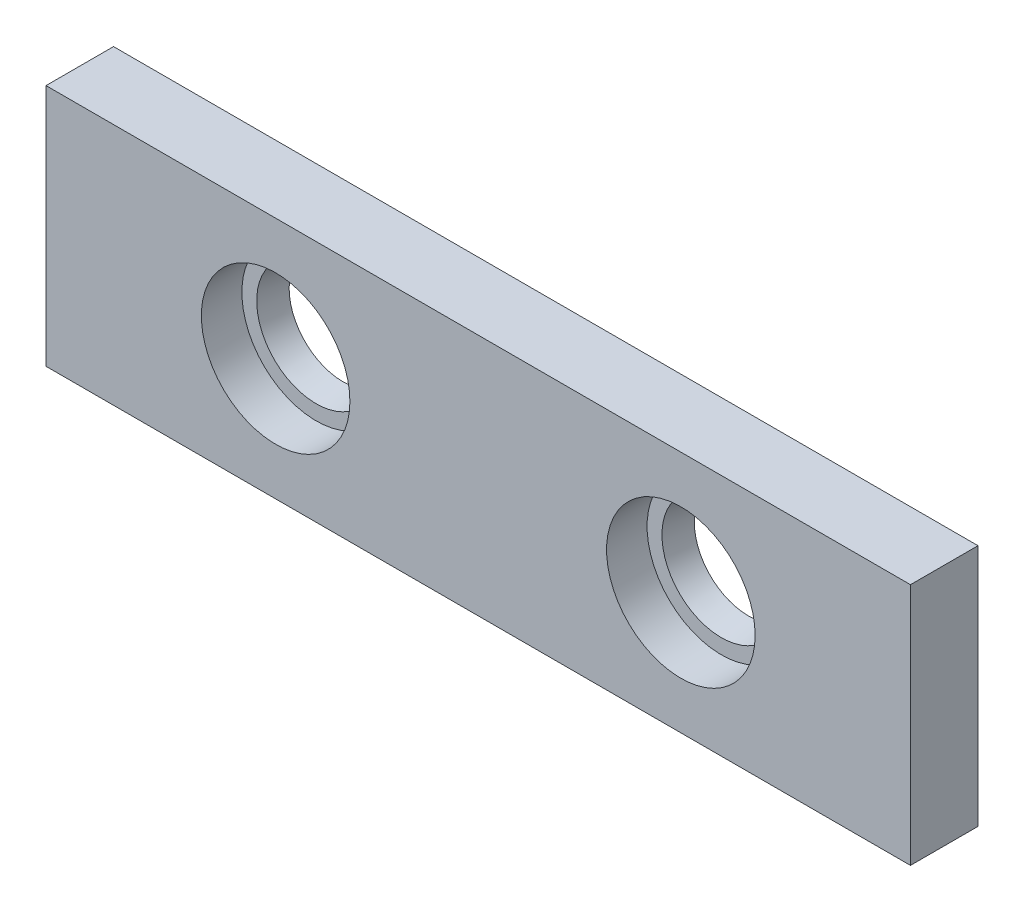
ISO-10303-21;
HEADER;
FILE_DESCRIPTION(('STEP AP214'),'2;1');
FILE_NAME('part.step','',(''),(''),'','','');
FILE_SCHEMA(('AUTOMOTIVE_DESIGN { 1 0 10303 214 1 1 1 1 }'));
ENDSEC;
DATA;
#1=APPLICATION_CONTEXT('core data for automotive mechanical design processes');
#2=APPLICATION_PROTOCOL_DEFINITION('international standard','automotive_design',2000,#1);
#3=PRODUCT_CONTEXT('',#1,'mechanical');
#4=PRODUCT('Part','Part','',(#3));
#5=PRODUCT_RELATED_PRODUCT_CATEGORY('part','',(#4));
#6=PRODUCT_DEFINITION_FORMATION('','',#4);
#7=PRODUCT_DEFINITION_CONTEXT('part definition',#1,'design');
#8=PRODUCT_DEFINITION('design','',#6,#7);
#9=PRODUCT_DEFINITION_SHAPE('','',#8);
#10=(LENGTH_UNIT() NAMED_UNIT(*) SI_UNIT(.MILLI.,.METRE.));
#11=(NAMED_UNIT(*) PLANE_ANGLE_UNIT() SI_UNIT($,.RADIAN.));
#12=(NAMED_UNIT(*) SI_UNIT($,.STERADIAN.) SOLID_ANGLE_UNIT());
#13=UNCERTAINTY_MEASURE_WITH_UNIT(LENGTH_MEASURE(1.E-05),#10,'distance_accuracy_value','');
#14=(GEOMETRIC_REPRESENTATION_CONTEXT(3) GLOBAL_UNCERTAINTY_ASSIGNED_CONTEXT((#13)) GLOBAL_UNIT_ASSIGNED_CONTEXT((#10,
#11,#12)) REPRESENTATION_CONTEXT('',''));
#15=CARTESIAN_POINT('',(0.,0.,0.));
#16=DIRECTION('',(0.,0.,1.));
#17=DIRECTION('',(1.,0.,0.));
#18=AXIS2_PLACEMENT_3D('',#15,#16,#17);
#19=CARTESIAN_POINT('',(0.,0.,5.));
#20=DIRECTION('',(0.,0.,-1.));
#21=DIRECTION('',(-1.,0.,0.));
#22=AXIS2_PLACEMENT_3D('',#19,#20,#21);
#23=PLANE('',#22);
#24=CARTESIAN_POINT('',(18.9208612165737,0.862610936427442,5.));
#25=DIRECTION('',(0.,0.,1.));
#26=DIRECTION('',(1.,0.,0.));
#27=AXIS2_PLACEMENT_3D('',#24,#25,#26);
#28=CIRCLE('',#27,5.5);
#29=CARTESIAN_POINT('',(24.4208612165736,0.862610936427442,5.));
#30=VERTEX_POINT('',#29);
#31=EDGE_CURVE('E179',#30,#30,#28,.T.);
#32=ORIENTED_EDGE('',*,*,#31,.F.);
#33=EDGE_LOOP('',(#32));
#34=FACE_BOUND('',#33,.T.);
#35=CARTESIAN_POINT('',(-11.0791387834266,0.862610936427438,5.));
#36=DIRECTION('',(0.,0.,1.));
#37=DIRECTION('',(1.,0.,0.));
#38=AXIS2_PLACEMENT_3D('',#35,#36,#37);
#39=CIRCLE('',#38,5.5);
#40=CARTESIAN_POINT('',(-5.57913878342655,0.862610936427438,5.));
#41=VERTEX_POINT('',#40);
#42=EDGE_CURVE('E165',#41,#41,#39,.T.);
#43=ORIENTED_EDGE('',*,*,#42,.F.);
#44=EDGE_LOOP('',(#43));
#45=FACE_BOUND('',#44,.T.);
#46=DIRECTION('',(1.,0.,0.));
#47=VECTOR('',#46,1.);
#48=CARTESIAN_POINT('',(-28.0791387834265,-8.13738906357256,5.));
#49=LINE('',#48,#47);
#50=CARTESIAN_POINT('',(-28.0791387834265,-8.13738906357256,5.));
#51=VERTEX_POINT('',#50);
#52=CARTESIAN_POINT('',(35.9208612165735,-8.13738906357256,5.));
#53=VERTEX_POINT('',#52);
#54=EDGE_CURVE('E113',#51,#53,#49,.T.);
#55=ORIENTED_EDGE('',*,*,#54,.T.);
#56=DIRECTION('',(0.,-1.,0.));
#57=VECTOR('',#56,1.);
#58=CARTESIAN_POINT('',(35.9208612165735,9.86261093642744,5.));
#59=LINE('',#58,#57);
#60=CARTESIAN_POINT('',(35.9208612165735,9.86261093642744,5.));
#61=VERTEX_POINT('',#60);
#62=EDGE_CURVE('E120',#61,#53,#59,.T.);
#63=ORIENTED_EDGE('',*,*,#62,.F.);
#64=DIRECTION('',(1.,0.,0.));
#65=VECTOR('',#64,1.);
#66=CARTESIAN_POINT('',(-28.0791387834265,9.86261093642744,5.));
#67=LINE('',#66,#65);
#68=CARTESIAN_POINT('',(-28.0791387834265,9.86261093642744,5.));
#69=VERTEX_POINT('',#68);
#70=EDGE_CURVE('E129',#69,#61,#67,.T.);
#71=ORIENTED_EDGE('',*,*,#70,.F.);
#72=DIRECTION('',(0.,-1.,0.));
#73=VECTOR('',#72,1.);
#74=CARTESIAN_POINT('',(-28.0791387834265,9.86261093642744,5.));
#75=LINE('',#74,#73);
#76=EDGE_CURVE('E90',#69,#51,#75,.T.);
#77=ORIENTED_EDGE('',*,*,#76,.T.);
#78=EDGE_LOOP('',(#55,#63,#71,#77));
#79=FACE_BOUND('',#78,.T.);
#80=ADVANCED_FACE('F70',(#34,#45,#79),#23,.F.);
#81=CARTESIAN_POINT('',(0.,0.,0.));
#82=DIRECTION('',(0.,0.,-1.));
#83=DIRECTION('',(-1.,0.,0.));
#84=AXIS2_PLACEMENT_3D('',#81,#82,#83);
#85=PLANE('',#84);
#86=CARTESIAN_POINT('',(18.9209996063444,0.862610936427444,0.));
#87=DIRECTION('',(0.,0.,-1.));
#88=DIRECTION('',(-1.,0.,0.));
#89=AXIS2_PLACEMENT_3D('',#86,#87,#88);
#90=CIRCLE('',#89,4.);
#91=CARTESIAN_POINT('',(14.9209996063444,0.862610936427444,0.));
#92=VERTEX_POINT('',#91);
#93=EDGE_CURVE('E173',#92,#92,#90,.T.);
#94=ORIENTED_EDGE('',*,*,#93,.F.);
#95=EDGE_LOOP('',(#94));
#96=FACE_BOUND('',#95,.T.);
#97=CARTESIAN_POINT('',(-11.0791387834265,0.862610936427444,0.));
#98=DIRECTION('',(0.,0.,-1.));
#99=DIRECTION('',(-1.,0.,0.));
#100=AXIS2_PLACEMENT_3D('',#97,#98,#99);
#101=CIRCLE('',#100,4.);
#102=CARTESIAN_POINT('',(-15.0791387834265,0.862610936427444,0.));
#103=VERTEX_POINT('',#102);
#104=EDGE_CURVE('E159',#103,#103,#101,.T.);
#105=ORIENTED_EDGE('',*,*,#104,.F.);
#106=EDGE_LOOP('',(#105));
#107=FACE_BOUND('',#106,.T.);
#108=DIRECTION('',(1.,0.,0.));
#109=VECTOR('',#108,1.);
#110=CARTESIAN_POINT('',(-28.0791387834265,-8.13738906357256,0.));
#111=LINE('',#110,#109);
#112=CARTESIAN_POINT('',(-28.0791387834265,-8.13738906357256,0.));
#113=VERTEX_POINT('',#112);
#114=CARTESIAN_POINT('',(35.9208612165735,-8.13738906357256,0.));
#115=VERTEX_POINT('',#114);
#116=EDGE_CURVE('E140',#113,#115,#111,.T.);
#117=ORIENTED_EDGE('',*,*,#116,.F.);
#118=DIRECTION('',(0.,-1.,0.));
#119=VECTOR('',#118,1.);
#120=CARTESIAN_POINT('',(-28.0791387834265,9.86261093642744,0.));
#121=LINE('',#120,#119);
#122=CARTESIAN_POINT('',(-28.0791387834265,9.86261093642744,0.));
#123=VERTEX_POINT('',#122);
#124=EDGE_CURVE('E108',#123,#113,#121,.T.);
#125=ORIENTED_EDGE('',*,*,#124,.F.);
#126=DIRECTION('',(1.,0.,0.));
#127=VECTOR('',#126,1.);
#128=CARTESIAN_POINT('',(-28.0791387834265,9.86261093642744,0.));
#129=LINE('',#128,#127);
#130=CARTESIAN_POINT('',(35.9208612165735,9.86261093642744,0.));
#131=VERTEX_POINT('',#130);
#132=EDGE_CURVE('E147',#123,#131,#129,.T.);
#133=ORIENTED_EDGE('',*,*,#132,.T.);
#134=DIRECTION('',(0.,-1.,0.));
#135=VECTOR('',#134,1.);
#136=CARTESIAN_POINT('',(35.9208612165735,9.86261093642744,0.));
#137=LINE('',#136,#135);
#138=EDGE_CURVE('E122',#131,#115,#137,.T.);
#139=ORIENTED_EDGE('',*,*,#138,.T.);
#140=EDGE_LOOP('',(#117,#125,#133,#139));
#141=FACE_BOUND('',#140,.T.);
#142=ADVANCED_FACE('F191',(#96,#107,#141),#85,.T.);
#143=CARTESIAN_POINT('',(-28.0791387834265,-8.13738906357256,5.));
#144=DIRECTION('',(0.,1.,0.));
#145=DIRECTION('',(0.,0.,1.));
#146=AXIS2_PLACEMENT_3D('',#143,#144,#145);
#147=PLANE('',#146);
#148=ORIENTED_EDGE('',*,*,#116,.T.);
#149=DIRECTION('',(0.,0.,-1.));
#150=VECTOR('',#149,1.);
#151=CARTESIAN_POINT('',(35.9208612165735,-8.13738906357256,5.));
#152=LINE('',#151,#150);
#153=EDGE_CURVE('E12',#53,#115,#152,.T.);
#154=ORIENTED_EDGE('',*,*,#153,.F.);
#155=ORIENTED_EDGE('',*,*,#54,.F.);
#156=DIRECTION('',(0.,0.,-1.));
#157=VECTOR('',#156,1.);
#158=CARTESIAN_POINT('',(-28.0791387834265,-8.13738906357256,5.));
#159=LINE('',#158,#157);
#160=EDGE_CURVE('E136',#51,#113,#159,.T.);
#161=ORIENTED_EDGE('',*,*,#160,.T.);
#162=EDGE_LOOP('',(#148,#154,#155,#161));
#163=FACE_BOUND('',#162,.T.);
#164=ADVANCED_FACE('F72',(#163),#147,.F.);
#165=CARTESIAN_POINT('',(35.9208612165735,9.86261093642744,5.));
#166=DIRECTION('',(1.,0.,0.));
#167=DIRECTION('',(0.,1.,0.));
#168=AXIS2_PLACEMENT_3D('',#165,#166,#167);
#169=PLANE('',#168);
#170=ORIENTED_EDGE('',*,*,#138,.F.);
#171=DIRECTION('',(0.,0.,-1.));
#172=VECTOR('',#171,1.);
#173=CARTESIAN_POINT('',(35.9208612165735,9.86261093642744,5.));
#174=LINE('',#173,#172);
#175=EDGE_CURVE('E81',#61,#131,#174,.T.);
#176=ORIENTED_EDGE('',*,*,#175,.F.);
#177=ORIENTED_EDGE('',*,*,#62,.T.);
#178=ORIENTED_EDGE('',*,*,#153,.T.);
#179=EDGE_LOOP('',(#170,#176,#177,#178));
#180=FACE_BOUND('',#179,.T.);
#181=ADVANCED_FACE('F119',(#180),#169,.T.);
#182=CARTESIAN_POINT('',(-28.0791387834265,9.86261093642744,5.));
#183=DIRECTION('',(0.,1.,0.));
#184=DIRECTION('',(0.,0.,1.));
#185=AXIS2_PLACEMENT_3D('',#182,#183,#184);
#186=PLANE('',#185);
#187=ORIENTED_EDGE('',*,*,#132,.F.);
#188=DIRECTION('',(0.,0.,-1.));
#189=VECTOR('',#188,1.);
#190=CARTESIAN_POINT('',(-28.0791387834265,9.86261093642744,5.));
#191=LINE('',#190,#189);
#192=EDGE_CURVE('E105',#69,#123,#191,.T.);
#193=ORIENTED_EDGE('',*,*,#192,.F.);
#194=ORIENTED_EDGE('',*,*,#70,.T.);
#195=ORIENTED_EDGE('',*,*,#175,.T.);
#196=EDGE_LOOP('',(#187,#193,#194,#195));
#197=FACE_BOUND('',#196,.T.);
#198=ADVANCED_FACE('F132',(#197),#186,.T.);
#199=CARTESIAN_POINT('',(-28.0791387834265,9.86261093642744,5.));
#200=DIRECTION('',(1.,0.,0.));
#201=DIRECTION('',(0.,1.,0.));
#202=AXIS2_PLACEMENT_3D('',#199,#200,#201);
#203=PLANE('',#202);
#204=ORIENTED_EDGE('',*,*,#124,.T.);
#205=ORIENTED_EDGE('',*,*,#160,.F.);
#206=ORIENTED_EDGE('',*,*,#76,.F.);
#207=ORIENTED_EDGE('',*,*,#192,.T.);
#208=EDGE_LOOP('',(#204,#205,#206,#207));
#209=FACE_BOUND('',#208,.T.);
#210=ADVANCED_FACE('F204',(#209),#203,.F.);
#211=CARTESIAN_POINT('',(18.9208612165737,0.862610936427442,2.));
#212=DIRECTION('',(0.,0.,1.));
#213=DIRECTION('',(1.,0.,0.));
#214=AXIS2_PLACEMENT_3D('',#211,#212,#213);
#215=PLANE('',#214);
#216=CARTESIAN_POINT('',(18.9209996063444,0.862610936427444,2.));
#217=DIRECTION('',(0.,0.,1.));
#218=DIRECTION('',(1.,0.,0.));
#219=AXIS2_PLACEMENT_3D('',#216,#217,#218);
#220=CIRCLE('',#219,4.4);
#221=CARTESIAN_POINT('',(23.3209996063444,0.862610936427444,2.));
#222=VERTEX_POINT('',#221);
#223=EDGE_CURVE('E74',#222,#222,#220,.F.);
#224=ORIENTED_EDGE('',*,*,#223,.T.);
#225=EDGE_LOOP('',(#224));
#226=FACE_BOUND('',#225,.T.);
#227=CARTESIAN_POINT('',(18.9208612165737,0.862610936427442,2.));
#228=DIRECTION('',(0.,0.,1.));
#229=DIRECTION('',(1.,0.,0.));
#230=AXIS2_PLACEMENT_3D('',#227,#228,#229);
#231=CIRCLE('',#230,5.5);
#232=CARTESIAN_POINT('',(24.4208612165736,0.862610936427442,2.));
#233=VERTEX_POINT('',#232);
#234=EDGE_CURVE('E144',#233,#233,#231,.T.);
#235=ORIENTED_EDGE('',*,*,#234,.T.);
#236=EDGE_LOOP('',(#235));
#237=FACE_BOUND('',#236,.T.);
#238=ADVANCED_FACE('F207',(#226,#237),#215,.T.);
#239=CARTESIAN_POINT('',(18.9208612165737,0.862610936427442,2.));
#240=DIRECTION('',(0.,0.,1.));
#241=DIRECTION('',(1.,0.,0.));
#242=AXIS2_PLACEMENT_3D('',#239,#240,#241);
#243=CYLINDRICAL_SURFACE('',#242,5.5);
#244=ORIENTED_EDGE('',*,*,#234,.F.);
#245=EDGE_LOOP('',(#244));
#246=FACE_BOUND('',#245,.T.);
#247=ORIENTED_EDGE('',*,*,#31,.T.);
#248=EDGE_LOOP('',(#247));
#249=FACE_BOUND('',#248,.T.);
#250=ADVANCED_FACE('F238',(#246,#249),#243,.F.);
#251=CARTESIAN_POINT('',(-11.0791387834266,0.862610936427438,2.));
#252=DIRECTION('',(0.,0.,1.));
#253=DIRECTION('',(1.,0.,0.));
#254=AXIS2_PLACEMENT_3D('',#251,#252,#253);
#255=CYLINDRICAL_SURFACE('',#254,5.5);
#256=CARTESIAN_POINT('',(-11.0791387834266,0.862610936427438,2.));
#257=DIRECTION('',(0.,0.,1.));
#258=DIRECTION('',(1.,0.,0.));
#259=AXIS2_PLACEMENT_3D('',#256,#257,#258);
#260=CIRCLE('',#259,5.5);
#261=CARTESIAN_POINT('',(-5.57913878342655,0.862610936427438,2.));
#262=VERTEX_POINT('',#261);
#263=EDGE_CURVE('E158',#262,#262,#260,.T.);
#264=ORIENTED_EDGE('',*,*,#263,.F.);
#265=EDGE_LOOP('',(#264));
#266=FACE_BOUND('',#265,.T.);
#267=ORIENTED_EDGE('',*,*,#42,.T.);
#268=EDGE_LOOP('',(#267));
#269=FACE_BOUND('',#268,.T.);
#270=ADVANCED_FACE('F188',(#266,#269),#255,.F.);
#271=CARTESIAN_POINT('',(-11.0791387834266,0.862610936427438,2.));
#272=DIRECTION('',(0.,0.,1.));
#273=DIRECTION('',(1.,0.,0.));
#274=AXIS2_PLACEMENT_3D('',#271,#272,#273);
#275=PLANE('',#274);
#276=CARTESIAN_POINT('',(-11.0791387834265,0.862610936427444,2.));
#277=DIRECTION('',(0.,0.,1.));
#278=DIRECTION('',(1.,0.,0.));
#279=AXIS2_PLACEMENT_3D('',#276,#277,#278);
#280=CIRCLE('',#279,4.4);
#281=CARTESIAN_POINT('',(-6.67913878342646,0.862610936427444,2.));
#282=VERTEX_POINT('',#281);
#283=EDGE_CURVE('E155',#282,#282,#280,.F.);
#284=ORIENTED_EDGE('',*,*,#283,.T.);
#285=EDGE_LOOP('',(#284));
#286=FACE_BOUND('',#285,.T.);
#287=ORIENTED_EDGE('',*,*,#263,.T.);
#288=EDGE_LOOP('',(#287));
#289=FACE_BOUND('',#288,.T.);
#290=ADVANCED_FACE('F201',(#286,#289),#275,.T.);
#291=CARTESIAN_POINT('',(-11.0791387834265,0.862610936427444,5.));
#292=DIRECTION('',(0.,0.,1.));
#293=DIRECTION('',(1.,0.,0.));
#294=AXIS2_PLACEMENT_3D('',#291,#292,#293);
#295=CONICAL_SURFACE('',#294,5.,0.197395559849881);
#296=ORIENTED_EDGE('',*,*,#283,.F.);
#297=EDGE_LOOP('',(#296));
#298=FACE_BOUND('',#297,.T.);
#299=ORIENTED_EDGE('',*,*,#104,.T.);
#300=EDGE_LOOP('',(#299));
#301=FACE_BOUND('',#300,.T.);
#302=ADVANCED_FACE('F229',(#298,#301),#295,.F.);
#303=CARTESIAN_POINT('',(18.9209996063444,0.862610936427444,4.99999999999999));
#304=DIRECTION('',(0.,0.,1.));
#305=DIRECTION('',(1.,0.,0.));
#306=AXIS2_PLACEMENT_3D('',#303,#304,#305);
#307=CONICAL_SURFACE('',#306,5.,0.197395559849881);
#308=ORIENTED_EDGE('',*,*,#223,.F.);
#309=EDGE_LOOP('',(#308));
#310=FACE_BOUND('',#309,.T.);
#311=ORIENTED_EDGE('',*,*,#93,.T.);
#312=EDGE_LOOP('',(#311));
#313=FACE_BOUND('',#312,.T.);
#314=ADVANCED_FACE('F247',(#310,#313),#307,.F.);
#315=CLOSED_SHELL('',(#80,#142,#164,#181,#198,#210,#238,#250,#270,#290,#302,#314));
#316=MANIFOLD_SOLID_BREP('B2',#315);
#317=ADVANCED_BREP_SHAPE_REPRESENTATION('',(#18,#316),#14);
#318=SHAPE_DEFINITION_REPRESENTATION(#9,#317);
ENDSEC;
END-ISO-10303-21;
